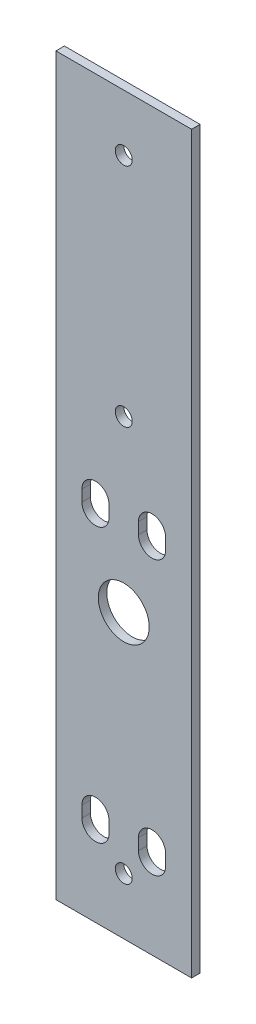
ISO-10303-21;
HEADER;
FILE_DESCRIPTION(('STEP AP214'),'2;1');
FILE_NAME('part.step','',(''),(''),'','','');
FILE_SCHEMA(('AUTOMOTIVE_DESIGN { 1 0 10303 214 1 1 1 1 }'));
ENDSEC;
DATA;
#1=APPLICATION_CONTEXT('core data for automotive mechanical design processes');
#2=APPLICATION_PROTOCOL_DEFINITION('international standard','automotive_design',2000,#1);
#3=PRODUCT_CONTEXT('',#1,'mechanical');
#4=PRODUCT('Part','Part','',(#3));
#5=PRODUCT_RELATED_PRODUCT_CATEGORY('part','',(#4));
#6=PRODUCT_DEFINITION_FORMATION('','',#4);
#7=PRODUCT_DEFINITION_CONTEXT('part definition',#1,'design');
#8=PRODUCT_DEFINITION('design','',#6,#7);
#9=PRODUCT_DEFINITION_SHAPE('','',#8);
#10=(LENGTH_UNIT() NAMED_UNIT(*) SI_UNIT(.MILLI.,.METRE.));
#11=(NAMED_UNIT(*) PLANE_ANGLE_UNIT() SI_UNIT($,.RADIAN.));
#12=(NAMED_UNIT(*) SI_UNIT($,.STERADIAN.) SOLID_ANGLE_UNIT());
#13=UNCERTAINTY_MEASURE_WITH_UNIT(LENGTH_MEASURE(1.E-05),#10,'distance_accuracy_value','');
#14=(GEOMETRIC_REPRESENTATION_CONTEXT(3) GLOBAL_UNCERTAINTY_ASSIGNED_CONTEXT((#13)) GLOBAL_UNIT_ASSIGNED_CONTEXT((#10,
#11,#12)) REPRESENTATION_CONTEXT('',''));
#15=CARTESIAN_POINT('',(0.,0.,0.));
#16=DIRECTION('',(0.,0.,1.));
#17=DIRECTION('',(1.,0.,0.));
#18=AXIS2_PLACEMENT_3D('',#15,#16,#17);
#19=CARTESIAN_POINT('',(0.,0.,1.5));
#20=DIRECTION('',(0.,0.,-1.));
#21=DIRECTION('',(-1.,0.,0.));
#22=AXIS2_PLACEMENT_3D('',#19,#20,#21);
#23=PLANE('',#22);
#24=CARTESIAN_POINT('',(-5.,-48.2,1.5));
#25=DIRECTION('',(0.,0.,1.));
#26=DIRECTION('',(-1.,0.,0.));
#27=AXIS2_PLACEMENT_3D('',#24,#25,#26);
#28=CIRCLE('',#27,2.4);
#29=CARTESIAN_POINT('',(-2.6,-48.2,1.5));
#30=VERTEX_POINT('',#29);
#31=CARTESIAN_POINT('',(-7.4,-48.2,1.5));
#32=VERTEX_POINT('',#31);
#33=EDGE_CURVE('E208',#30,#32,#28,.T.);
#34=ORIENTED_EDGE('',*,*,#33,.F.);
#35=DIRECTION('',(0.,1.,0.));
#36=VECTOR('',#35,1.);
#37=CARTESIAN_POINT('',(-2.6,-48.2,1.5));
#38=LINE('',#37,#36);
#39=CARTESIAN_POINT('',(-2.6,-50.2,1.5));
#40=VERTEX_POINT('',#39);
#41=EDGE_CURVE('E216',#40,#30,#38,.T.);
#42=ORIENTED_EDGE('',*,*,#41,.F.);
#43=CARTESIAN_POINT('',(-5.,-50.2,1.5));
#44=DIRECTION('',(0.,0.,1.));
#45=DIRECTION('',(-1.,0.,0.));
#46=AXIS2_PLACEMENT_3D('',#43,#44,#45);
#47=CIRCLE('',#46,2.4);
#48=CARTESIAN_POINT('',(-7.4,-50.2,1.5));
#49=VERTEX_POINT('',#48);
#50=EDGE_CURVE('E213',#49,#40,#47,.T.);
#51=ORIENTED_EDGE('',*,*,#50,.F.);
#52=DIRECTION('',(0.,-1.,0.));
#53=VECTOR('',#52,1.);
#54=CARTESIAN_POINT('',(-7.4,-48.2,1.5));
#55=LINE('',#54,#53);
#56=EDGE_CURVE('E210',#32,#49,#55,.T.);
#57=ORIENTED_EDGE('',*,*,#56,.F.);
#58=EDGE_LOOP('',(#34,#42,#51,#57));
#59=FACE_BOUND('',#58,.T.);
#60=CARTESIAN_POINT('',(-5.,-1.8,1.5));
#61=DIRECTION('',(0.,0.,1.));
#62=DIRECTION('',(1.,0.,0.));
#63=AXIS2_PLACEMENT_3D('',#60,#61,#62);
#64=CIRCLE('',#63,2.4);
#65=CARTESIAN_POINT('',(-7.4,-1.8,1.5));
#66=VERTEX_POINT('',#65);
#67=CARTESIAN_POINT('',(-2.6,-1.8,1.5));
#68=VERTEX_POINT('',#67);
#69=EDGE_CURVE('E270',#66,#68,#64,.T.);
#70=ORIENTED_EDGE('',*,*,#69,.F.);
#71=DIRECTION('',(0.,-1.,0.));
#72=VECTOR('',#71,1.);
#73=CARTESIAN_POINT('',(-7.4,-1.8,1.5));
#74=LINE('',#73,#72);
#75=CARTESIAN_POINT('',(-7.4,0.200000000000001,1.5));
#76=VERTEX_POINT('',#75);
#77=EDGE_CURVE('E278',#76,#66,#74,.T.);
#78=ORIENTED_EDGE('',*,*,#77,.F.);
#79=CARTESIAN_POINT('',(-5.,0.200000000000002,1.5));
#80=DIRECTION('',(0.,0.,1.));
#81=DIRECTION('',(1.,0.,0.));
#82=AXIS2_PLACEMENT_3D('',#79,#80,#81);
#83=CIRCLE('',#82,2.4);
#84=CARTESIAN_POINT('',(-2.6,0.200000000000003,1.5));
#85=VERTEX_POINT('',#84);
#86=EDGE_CURVE('E275',#85,#76,#83,.T.);
#87=ORIENTED_EDGE('',*,*,#86,.F.);
#88=DIRECTION('',(0.,1.,0.));
#89=VECTOR('',#88,1.);
#90=CARTESIAN_POINT('',(-2.6,-1.8,1.5));
#91=LINE('',#90,#89);
#92=EDGE_CURVE('E272',#68,#85,#91,.T.);
#93=ORIENTED_EDGE('',*,*,#92,.F.);
#94=EDGE_LOOP('',(#70,#78,#87,#93));
#95=FACE_BOUND('',#94,.T.);
#96=DIRECTION('',(0.,-1.,0.));
#97=VECTOR('',#96,1.);
#98=CARTESIAN_POINT('',(-12.,65.,1.5));
#99=LINE('',#98,#97);
#100=CARTESIAN_POINT('',(-12.,65.,1.5));
#101=VERTEX_POINT('',#100);
#102=CARTESIAN_POINT('',(-12.,-65.,1.5));
#103=VERTEX_POINT('',#102);
#104=EDGE_CURVE('E325',#101,#103,#99,.T.);
#105=ORIENTED_EDGE('',*,*,#104,.T.);
#106=DIRECTION('',(1.,0.,0.));
#107=VECTOR('',#106,1.);
#108=CARTESIAN_POINT('',(12.,-65.,1.5));
#109=LINE('',#108,#107);
#110=CARTESIAN_POINT('',(12.,-65.,1.5));
#111=VERTEX_POINT('',#110);
#112=EDGE_CURVE('E328',#103,#111,#109,.T.);
#113=ORIENTED_EDGE('',*,*,#112,.T.);
#114=DIRECTION('',(0.,1.,0.));
#115=VECTOR('',#114,1.);
#116=CARTESIAN_POINT('',(12.,65.,1.5));
#117=LINE('',#116,#115);
#118=CARTESIAN_POINT('',(12.,65.,1.5));
#119=VERTEX_POINT('',#118);
#120=EDGE_CURVE('E331',#111,#119,#117,.T.);
#121=ORIENTED_EDGE('',*,*,#120,.T.);
#122=DIRECTION('',(-1.,0.,0.));
#123=VECTOR('',#122,1.);
#124=CARTESIAN_POINT('',(12.,65.,1.5));
#125=LINE('',#124,#123);
#126=EDGE_CURVE('E333',#119,#101,#125,.T.);
#127=ORIENTED_EDGE('',*,*,#126,.T.);
#128=EDGE_LOOP('',(#105,#113,#121,#127));
#129=FACE_BOUND('',#128,.T.);
#130=CARTESIAN_POINT('',(0.,15.,1.5));
#131=DIRECTION('',(0.,0.,1.));
#132=DIRECTION('',(1.,0.,0.));
#133=AXIS2_PLACEMENT_3D('',#130,#131,#132);
#134=CIRCLE('',#133,1.5);
#135=CARTESIAN_POINT('',(1.5,15.,1.5));
#136=VERTEX_POINT('',#135);
#137=EDGE_CURVE('E319',#136,#136,#134,.T.);
#138=ORIENTED_EDGE('',*,*,#137,.F.);
#139=EDGE_LOOP('',(#138));
#140=FACE_BOUND('',#139,.T.);
#141=CARTESIAN_POINT('',(0.,-15.,1.5));
#142=DIRECTION('',(0.,0.,1.));
#143=DIRECTION('',(1.,0.,0.));
#144=AXIS2_PLACEMENT_3D('',#141,#142,#143);
#145=CIRCLE('',#144,4.5);
#146=CARTESIAN_POINT('',(4.5,-15.,1.5));
#147=VERTEX_POINT('',#146);
#148=EDGE_CURVE('E313',#147,#147,#145,.T.);
#149=ORIENTED_EDGE('',*,*,#148,.F.);
#150=EDGE_LOOP('',(#149));
#151=FACE_BOUND('',#150,.T.);
#152=CARTESIAN_POINT('',(0.,-55.,1.5));
#153=DIRECTION('',(0.,0.,1.));
#154=DIRECTION('',(1.,0.,0.));
#155=AXIS2_PLACEMENT_3D('',#152,#153,#154);
#156=CIRCLE('',#155,1.5);
#157=CARTESIAN_POINT('',(1.5,-55.,1.5));
#158=VERTEX_POINT('',#157);
#159=EDGE_CURVE('E307',#158,#158,#156,.T.);
#160=ORIENTED_EDGE('',*,*,#159,.F.);
#161=EDGE_LOOP('',(#160));
#162=FACE_BOUND('',#161,.T.);
#163=CARTESIAN_POINT('',(0.,55.,1.5));
#164=DIRECTION('',(0.,0.,1.));
#165=DIRECTION('',(-1.,0.,0.));
#166=AXIS2_PLACEMENT_3D('',#163,#164,#165);
#167=CIRCLE('',#166,1.5);
#168=CARTESIAN_POINT('',(-1.50000000000001,55.,1.5));
#169=VERTEX_POINT('',#168);
#170=EDGE_CURVE('E301',#169,#169,#167,.T.);
#171=ORIENTED_EDGE('',*,*,#170,.F.);
#172=EDGE_LOOP('',(#171));
#173=FACE_BOUND('',#172,.T.);
#174=CARTESIAN_POINT('',(4.99999999999998,-1.8,1.5));
#175=DIRECTION('',(0.,0.,1.));
#176=DIRECTION('',(-1.,0.,0.));
#177=AXIS2_PLACEMENT_3D('',#174,#175,#176);
#178=CIRCLE('',#177,2.4);
#179=CARTESIAN_POINT('',(2.59999999999998,-1.8,1.5));
#180=VERTEX_POINT('',#179);
#181=CARTESIAN_POINT('',(7.39999999999998,-1.8,1.5));
#182=VERTEX_POINT('',#181);
#183=EDGE_CURVE('E239',#180,#182,#178,.T.);
#184=ORIENTED_EDGE('',*,*,#183,.F.);
#185=DIRECTION('',(0.,-1.,0.));
#186=VECTOR('',#185,1.);
#187=CARTESIAN_POINT('',(2.59999999999998,-1.8,1.5));
#188=LINE('',#187,#186);
#189=CARTESIAN_POINT('',(2.59999999999998,0.200000000000003,1.5));
#190=VERTEX_POINT('',#189);
#191=EDGE_CURVE('E247',#190,#180,#188,.T.);
#192=ORIENTED_EDGE('',*,*,#191,.F.);
#193=CARTESIAN_POINT('',(4.99999999999998,0.200000000000002,1.5));
#194=DIRECTION('',(0.,0.,1.));
#195=DIRECTION('',(-1.,0.,0.));
#196=AXIS2_PLACEMENT_3D('',#193,#194,#195);
#197=CIRCLE('',#196,2.4);
#198=CARTESIAN_POINT('',(7.39999999999998,0.200000000000001,1.5));
#199=VERTEX_POINT('',#198);
#200=EDGE_CURVE('E244',#199,#190,#197,.T.);
#201=ORIENTED_EDGE('',*,*,#200,.F.);
#202=DIRECTION('',(0.,1.,0.));
#203=VECTOR('',#202,1.);
#204=CARTESIAN_POINT('',(7.39999999999998,-1.8,1.5));
#205=LINE('',#204,#203);
#206=EDGE_CURVE('E241',#182,#199,#205,.T.);
#207=ORIENTED_EDGE('',*,*,#206,.F.);
#208=EDGE_LOOP('',(#184,#192,#201,#207));
#209=FACE_BOUND('',#208,.T.);
#210=CARTESIAN_POINT('',(4.99999999999998,-48.2,1.5));
#211=DIRECTION('',(0.,0.,1.));
#212=DIRECTION('',(1.,0.,0.));
#213=AXIS2_PLACEMENT_3D('',#210,#211,#212);
#214=CIRCLE('',#213,2.4);
#215=CARTESIAN_POINT('',(7.39999999999998,-48.2,1.5));
#216=VERTEX_POINT('',#215);
#217=CARTESIAN_POINT('',(2.59999999999998,-48.2,1.5));
#218=VERTEX_POINT('',#217);
#219=EDGE_CURVE('E172',#216,#218,#214,.T.);
#220=ORIENTED_EDGE('',*,*,#219,.F.);
#221=DIRECTION('',(0.,1.,0.));
#222=VECTOR('',#221,1.);
#223=CARTESIAN_POINT('',(7.39999999999998,-48.2,1.5));
#224=LINE('',#223,#222);
#225=CARTESIAN_POINT('',(7.39999999999998,-50.2,1.5));
#226=VERTEX_POINT('',#225);
#227=EDGE_CURVE('E194',#226,#216,#224,.T.);
#228=ORIENTED_EDGE('',*,*,#227,.F.);
#229=CARTESIAN_POINT('',(4.99999999999998,-50.2,1.5));
#230=DIRECTION('',(0.,0.,1.));
#231=DIRECTION('',(1.,0.,0.));
#232=AXIS2_PLACEMENT_3D('',#229,#230,#231);
#233=CIRCLE('',#232,2.4);
#234=CARTESIAN_POINT('',(2.59999999999998,-50.2,1.5));
#235=VERTEX_POINT('',#234);
#236=EDGE_CURVE('E192',#235,#226,#233,.T.);
#237=ORIENTED_EDGE('',*,*,#236,.F.);
#238=DIRECTION('',(0.,-1.,0.));
#239=VECTOR('',#238,1.);
#240=CARTESIAN_POINT('',(2.59999999999998,-48.2,1.5));
#241=LINE('',#240,#239);
#242=EDGE_CURVE('E180',#218,#235,#241,.T.);
#243=ORIENTED_EDGE('',*,*,#242,.F.);
#244=EDGE_LOOP('',(#220,#228,#237,#243));
#245=FACE_BOUND('',#244,.T.);
#246=ADVANCED_FACE('F35',(#59,#95,#129,#140,#151,#162,#173,#209,#245),#23,.F.);
#247=CARTESIAN_POINT('',(0.,0.,0.));
#248=DIRECTION('',(0.,0.,-1.));
#249=DIRECTION('',(-1.,0.,0.));
#250=AXIS2_PLACEMENT_3D('',#247,#248,#249);
#251=PLANE('',#250);
#252=CARTESIAN_POINT('',(0.,-55.,0.));
#253=DIRECTION('',(0.,0.,1.));
#254=DIRECTION('',(1.,0.,0.));
#255=AXIS2_PLACEMENT_3D('',#252,#253,#254);
#256=CIRCLE('',#255,1.5);
#257=CARTESIAN_POINT('',(1.5,-55.,0.));
#258=VERTEX_POINT('',#257);
#259=EDGE_CURVE('E304',#258,#258,#256,.T.);
#260=ORIENTED_EDGE('',*,*,#259,.T.);
#261=EDGE_LOOP('',(#260));
#262=FACE_BOUND('',#261,.T.);
#263=CARTESIAN_POINT('',(0.,15.,0.));
#264=DIRECTION('',(0.,0.,1.));
#265=DIRECTION('',(1.,0.,0.));
#266=AXIS2_PLACEMENT_3D('',#263,#264,#265);
#267=CIRCLE('',#266,1.5);
#268=CARTESIAN_POINT('',(1.5,15.,0.));
#269=VERTEX_POINT('',#268);
#270=EDGE_CURVE('E316',#269,#269,#267,.T.);
#271=ORIENTED_EDGE('',*,*,#270,.T.);
#272=EDGE_LOOP('',(#271));
#273=FACE_BOUND('',#272,.T.);
#274=DIRECTION('',(0.,-1.,0.));
#275=VECTOR('',#274,1.);
#276=CARTESIAN_POINT('',(-12.,65.,0.));
#277=LINE('',#276,#275);
#278=CARTESIAN_POINT('',(-12.,65.,0.));
#279=VERTEX_POINT('',#278);
#280=CARTESIAN_POINT('',(-12.,-65.,0.));
#281=VERTEX_POINT('',#280);
#282=EDGE_CURVE('E322',#279,#281,#277,.T.);
#283=ORIENTED_EDGE('',*,*,#282,.F.);
#284=DIRECTION('',(-1.,0.,0.));
#285=VECTOR('',#284,1.);
#286=CARTESIAN_POINT('',(12.,65.,0.));
#287=LINE('',#286,#285);
#288=CARTESIAN_POINT('',(12.,65.,0.));
#289=VERTEX_POINT('',#288);
#290=EDGE_CURVE('E329',#289,#279,#287,.T.);
#291=ORIENTED_EDGE('',*,*,#290,.F.);
#292=DIRECTION('',(0.,1.,0.));
#293=VECTOR('',#292,1.);
#294=CARTESIAN_POINT('',(12.,65.,0.));
#295=LINE('',#294,#293);
#296=CARTESIAN_POINT('',(12.,-65.,0.));
#297=VERTEX_POINT('',#296);
#298=EDGE_CURVE('E340',#297,#289,#295,.T.);
#299=ORIENTED_EDGE('',*,*,#298,.F.);
#300=DIRECTION('',(1.,0.,0.));
#301=VECTOR('',#300,1.);
#302=CARTESIAN_POINT('',(12.,-65.,0.));
#303=LINE('',#302,#301);
#304=EDGE_CURVE('E338',#281,#297,#303,.T.);
#305=ORIENTED_EDGE('',*,*,#304,.F.);
#306=EDGE_LOOP('',(#283,#291,#299,#305));
#307=FACE_BOUND('',#306,.T.);
#308=CARTESIAN_POINT('',(0.,-15.,0.));
#309=DIRECTION('',(0.,0.,1.));
#310=DIRECTION('',(1.,0.,0.));
#311=AXIS2_PLACEMENT_3D('',#308,#309,#310);
#312=CIRCLE('',#311,4.5);
#313=CARTESIAN_POINT('',(4.5,-15.,0.));
#314=VERTEX_POINT('',#313);
#315=EDGE_CURVE('E310',#314,#314,#312,.T.);
#316=ORIENTED_EDGE('',*,*,#315,.T.);
#317=EDGE_LOOP('',(#316));
#318=FACE_BOUND('',#317,.T.);
#319=CARTESIAN_POINT('',(0.,55.,0.));
#320=DIRECTION('',(0.,0.,1.));
#321=DIRECTION('',(-1.,0.,0.));
#322=AXIS2_PLACEMENT_3D('',#319,#320,#321);
#323=CIRCLE('',#322,1.5);
#324=CARTESIAN_POINT('',(-1.50000000000001,55.,0.));
#325=VERTEX_POINT('',#324);
#326=EDGE_CURVE('E300',#325,#325,#323,.T.);
#327=ORIENTED_EDGE('',*,*,#326,.T.);
#328=EDGE_LOOP('',(#327));
#329=FACE_BOUND('',#328,.T.);
#330=DIRECTION('',(0.,-1.,0.));
#331=VECTOR('',#330,1.);
#332=CARTESIAN_POINT('',(-7.4,-1.8,0.));
#333=LINE('',#332,#331);
#334=CARTESIAN_POINT('',(-7.4,0.200000000000001,0.));
#335=VERTEX_POINT('',#334);
#336=CARTESIAN_POINT('',(-7.4,-1.8,0.));
#337=VERTEX_POINT('',#336);
#338=EDGE_CURVE('E273',#335,#337,#333,.T.);
#339=ORIENTED_EDGE('',*,*,#338,.T.);
#340=CARTESIAN_POINT('',(-5.,-1.8,0.));
#341=DIRECTION('',(0.,0.,1.));
#342=DIRECTION('',(1.,0.,0.));
#343=AXIS2_PLACEMENT_3D('',#340,#341,#342);
#344=CIRCLE('',#343,2.4);
#345=CARTESIAN_POINT('',(-2.6,-1.8,0.));
#346=VERTEX_POINT('',#345);
#347=EDGE_CURVE('E269',#337,#346,#344,.T.);
#348=ORIENTED_EDGE('',*,*,#347,.T.);
#349=DIRECTION('',(0.,1.,0.));
#350=VECTOR('',#349,1.);
#351=CARTESIAN_POINT('',(-2.6,-1.8,0.));
#352=LINE('',#351,#350);
#353=CARTESIAN_POINT('',(-2.6,0.200000000000003,0.));
#354=VERTEX_POINT('',#353);
#355=EDGE_CURVE('E283',#346,#354,#352,.T.);
#356=ORIENTED_EDGE('',*,*,#355,.T.);
#357=CARTESIAN_POINT('',(-5.,0.200000000000002,0.));
#358=DIRECTION('',(0.,0.,1.));
#359=DIRECTION('',(1.,0.,0.));
#360=AXIS2_PLACEMENT_3D('',#357,#358,#359);
#361=CIRCLE('',#360,2.4);
#362=EDGE_CURVE('E286',#354,#335,#361,.T.);
#363=ORIENTED_EDGE('',*,*,#362,.T.);
#364=EDGE_LOOP('',(#339,#348,#356,#363));
#365=FACE_BOUND('',#364,.T.);
#366=DIRECTION('',(0.,-1.,0.));
#367=VECTOR('',#366,1.);
#368=CARTESIAN_POINT('',(2.59999999999998,-1.8,0.));
#369=LINE('',#368,#367);
#370=CARTESIAN_POINT('',(2.59999999999998,0.200000000000003,0.));
#371=VERTEX_POINT('',#370);
#372=CARTESIAN_POINT('',(2.59999999999998,-1.8,0.));
#373=VERTEX_POINT('',#372);
#374=EDGE_CURVE('E242',#371,#373,#369,.T.);
#375=ORIENTED_EDGE('',*,*,#374,.T.);
#376=CARTESIAN_POINT('',(4.99999999999998,-1.8,0.));
#377=DIRECTION('',(0.,0.,1.));
#378=DIRECTION('',(-1.,0.,0.));
#379=AXIS2_PLACEMENT_3D('',#376,#377,#378);
#380=CIRCLE('',#379,2.4);
#381=CARTESIAN_POINT('',(7.39999999999998,-1.8,0.));
#382=VERTEX_POINT('',#381);
#383=EDGE_CURVE('E238',#373,#382,#380,.T.);
#384=ORIENTED_EDGE('',*,*,#383,.T.);
#385=DIRECTION('',(0.,1.,0.));
#386=VECTOR('',#385,1.);
#387=CARTESIAN_POINT('',(7.39999999999998,-1.8,0.));
#388=LINE('',#387,#386);
#389=CARTESIAN_POINT('',(7.39999999999998,0.200000000000001,0.));
#390=VERTEX_POINT('',#389);
#391=EDGE_CURVE('E252',#382,#390,#388,.T.);
#392=ORIENTED_EDGE('',*,*,#391,.T.);
#393=CARTESIAN_POINT('',(4.99999999999998,0.200000000000002,0.));
#394=DIRECTION('',(0.,0.,1.));
#395=DIRECTION('',(-1.,0.,0.));
#396=AXIS2_PLACEMENT_3D('',#393,#394,#395);
#397=CIRCLE('',#396,2.4);
#398=EDGE_CURVE('E255',#390,#371,#397,.T.);
#399=ORIENTED_EDGE('',*,*,#398,.T.);
#400=EDGE_LOOP('',(#375,#384,#392,#399));
#401=FACE_BOUND('',#400,.T.);
#402=DIRECTION('',(0.,1.,0.));
#403=VECTOR('',#402,1.);
#404=CARTESIAN_POINT('',(-2.6,-48.2,0.));
#405=LINE('',#404,#403);
#406=CARTESIAN_POINT('',(-2.6,-50.2,0.));
#407=VERTEX_POINT('',#406);
#408=CARTESIAN_POINT('',(-2.6,-48.2,0.));
#409=VERTEX_POINT('',#408);
#410=EDGE_CURVE('E211',#407,#409,#405,.T.);
#411=ORIENTED_EDGE('',*,*,#410,.T.);
#412=CARTESIAN_POINT('',(-5.,-48.2,0.));
#413=DIRECTION('',(0.,0.,1.));
#414=DIRECTION('',(-1.,0.,0.));
#415=AXIS2_PLACEMENT_3D('',#412,#413,#414);
#416=CIRCLE('',#415,2.4);
#417=CARTESIAN_POINT('',(-7.4,-48.2,0.));
#418=VERTEX_POINT('',#417);
#419=EDGE_CURVE('E188',#409,#418,#416,.T.);
#420=ORIENTED_EDGE('',*,*,#419,.T.);
#421=DIRECTION('',(0.,-1.,0.));
#422=VECTOR('',#421,1.);
#423=CARTESIAN_POINT('',(-7.4,-48.2,0.));
#424=LINE('',#423,#422);
#425=CARTESIAN_POINT('',(-7.4,-50.2,0.));
#426=VERTEX_POINT('',#425);
#427=EDGE_CURVE('E221',#418,#426,#424,.T.);
#428=ORIENTED_EDGE('',*,*,#427,.T.);
#429=CARTESIAN_POINT('',(-5.,-50.2,0.));
#430=DIRECTION('',(0.,0.,1.));
#431=DIRECTION('',(-1.,0.,0.));
#432=AXIS2_PLACEMENT_3D('',#429,#430,#431);
#433=CIRCLE('',#432,2.4);
#434=EDGE_CURVE('E224',#426,#407,#433,.T.);
#435=ORIENTED_EDGE('',*,*,#434,.T.);
#436=EDGE_LOOP('',(#411,#420,#428,#435));
#437=FACE_BOUND('',#436,.T.);
#438=DIRECTION('',(0.,1.,0.));
#439=VECTOR('',#438,1.);
#440=CARTESIAN_POINT('',(7.39999999999998,-48.2,0.));
#441=LINE('',#440,#439);
#442=CARTESIAN_POINT('',(7.39999999999998,-50.2,0.));
#443=VERTEX_POINT('',#442);
#444=CARTESIAN_POINT('',(7.39999999999998,-48.2,0.));
#445=VERTEX_POINT('',#444);
#446=EDGE_CURVE('E181',#443,#445,#441,.T.);
#447=ORIENTED_EDGE('',*,*,#446,.T.);
#448=CARTESIAN_POINT('',(4.99999999999998,-48.2,0.));
#449=DIRECTION('',(0.,0.,1.));
#450=DIRECTION('',(1.,0.,0.));
#451=AXIS2_PLACEMENT_3D('',#448,#449,#450);
#452=CIRCLE('',#451,2.4);
#453=CARTESIAN_POINT('',(2.59999999999998,-48.2,0.));
#454=VERTEX_POINT('',#453);
#455=EDGE_CURVE('E58',#445,#454,#452,.T.);
#456=ORIENTED_EDGE('',*,*,#455,.T.);
#457=DIRECTION('',(0.,-1.,0.));
#458=VECTOR('',#457,1.);
#459=CARTESIAN_POINT('',(2.59999999999998,-48.2,0.));
#460=LINE('',#459,#458);
#461=CARTESIAN_POINT('',(2.59999999999998,-50.2,0.));
#462=VERTEX_POINT('',#461);
#463=EDGE_CURVE('E187',#454,#462,#460,.T.);
#464=ORIENTED_EDGE('',*,*,#463,.T.);
#465=CARTESIAN_POINT('',(4.99999999999998,-50.2,0.));
#466=DIRECTION('',(0.,0.,1.));
#467=DIRECTION('',(1.,0.,0.));
#468=AXIS2_PLACEMENT_3D('',#465,#466,#467);
#469=CIRCLE('',#468,2.4);
#470=EDGE_CURVE('E200',#462,#443,#469,.T.);
#471=ORIENTED_EDGE('',*,*,#470,.T.);
#472=EDGE_LOOP('',(#447,#456,#464,#471));
#473=FACE_BOUND('',#472,.T.);
#474=ADVANCED_FACE('F358',(#262,#273,#307,#318,#329,#365,#401,#437,#473),#251,.T.);
#475=CARTESIAN_POINT('',(-12.,65.,1.5));
#476=DIRECTION('',(1.,0.,0.));
#477=DIRECTION('',(0.,0.,-1.));
#478=AXIS2_PLACEMENT_3D('',#475,#476,#477);
#479=PLANE('',#478);
#480=ORIENTED_EDGE('',*,*,#282,.T.);
#481=DIRECTION('',(0.,0.,-1.));
#482=VECTOR('',#481,1.);
#483=CARTESIAN_POINT('',(-12.,-65.,1.5));
#484=LINE('',#483,#482);
#485=EDGE_CURVE('E11',#103,#281,#484,.T.);
#486=ORIENTED_EDGE('',*,*,#485,.F.);
#487=ORIENTED_EDGE('',*,*,#104,.F.);
#488=DIRECTION('',(0.,0.,-1.));
#489=VECTOR('',#488,1.);
#490=CARTESIAN_POINT('',(-12.,65.,1.5));
#491=LINE('',#490,#489);
#492=EDGE_CURVE('E335',#101,#279,#491,.T.);
#493=ORIENTED_EDGE('',*,*,#492,.T.);
#494=EDGE_LOOP('',(#480,#486,#487,#493));
#495=FACE_BOUND('',#494,.T.);
#496=ADVANCED_FACE('F37',(#495),#479,.F.);
#497=CARTESIAN_POINT('',(12.,-65.,1.5));
#498=DIRECTION('',(0.,1.,0.));
#499=DIRECTION('',(0.,0.,1.));
#500=AXIS2_PLACEMENT_3D('',#497,#498,#499);
#501=PLANE('',#500);
#502=ORIENTED_EDGE('',*,*,#304,.T.);
#503=DIRECTION('',(0.,0.,-1.));
#504=VECTOR('',#503,1.);
#505=CARTESIAN_POINT('',(12.,-65.,1.5));
#506=LINE('',#505,#504);
#507=EDGE_CURVE('E43',#111,#297,#506,.T.);
#508=ORIENTED_EDGE('',*,*,#507,.F.);
#509=ORIENTED_EDGE('',*,*,#112,.F.);
#510=ORIENTED_EDGE('',*,*,#485,.T.);
#511=EDGE_LOOP('',(#502,#508,#509,#510));
#512=FACE_BOUND('',#511,.T.);
#513=ADVANCED_FACE('F369',(#512),#501,.F.);
#514=CARTESIAN_POINT('',(12.,65.,1.5));
#515=DIRECTION('',(-1.,0.,0.));
#516=DIRECTION('',(0.,0.,1.));
#517=AXIS2_PLACEMENT_3D('',#514,#515,#516);
#518=PLANE('',#517);
#519=ORIENTED_EDGE('',*,*,#298,.T.);
#520=DIRECTION('',(0.,0.,-1.));
#521=VECTOR('',#520,1.);
#522=CARTESIAN_POINT('',(12.,65.,1.5));
#523=LINE('',#522,#521);
#524=EDGE_CURVE('E345',#119,#289,#523,.T.);
#525=ORIENTED_EDGE('',*,*,#524,.F.);
#526=ORIENTED_EDGE('',*,*,#120,.F.);
#527=ORIENTED_EDGE('',*,*,#507,.T.);
#528=EDGE_LOOP('',(#519,#525,#526,#527));
#529=FACE_BOUND('',#528,.T.);
#530=ADVANCED_FACE('F352',(#529),#518,.F.);
#531=CARTESIAN_POINT('',(12.,65.,1.5));
#532=DIRECTION('',(0.,-1.,0.));
#533=DIRECTION('',(0.,0.,-1.));
#534=AXIS2_PLACEMENT_3D('',#531,#532,#533);
#535=PLANE('',#534);
#536=ORIENTED_EDGE('',*,*,#290,.T.);
#537=ORIENTED_EDGE('',*,*,#492,.F.);
#538=ORIENTED_EDGE('',*,*,#126,.F.);
#539=ORIENTED_EDGE('',*,*,#524,.T.);
#540=EDGE_LOOP('',(#536,#537,#538,#539));
#541=FACE_BOUND('',#540,.T.);
#542=ADVANCED_FACE('F362',(#541),#535,.F.);
#543=CARTESIAN_POINT('',(0.,15.,1.5));
#544=DIRECTION('',(0.,0.,-1.));
#545=DIRECTION('',(-1.,0.,0.));
#546=AXIS2_PLACEMENT_3D('',#543,#544,#545);
#547=CYLINDRICAL_SURFACE('',#546,1.5);
#548=ORIENTED_EDGE('',*,*,#137,.T.);
#549=EDGE_LOOP('',(#548));
#550=FACE_BOUND('',#549,.T.);
#551=ORIENTED_EDGE('',*,*,#270,.F.);
#552=EDGE_LOOP('',(#551));
#553=FACE_BOUND('',#552,.T.);
#554=ADVANCED_FACE('F387',(#550,#553),#547,.F.);
#555=CARTESIAN_POINT('',(0.,-15.,1.5));
#556=DIRECTION('',(0.,0.,-1.));
#557=DIRECTION('',(-1.,0.,0.));
#558=AXIS2_PLACEMENT_3D('',#555,#556,#557);
#559=CYLINDRICAL_SURFACE('',#558,4.5);
#560=ORIENTED_EDGE('',*,*,#148,.T.);
#561=EDGE_LOOP('',(#560));
#562=FACE_BOUND('',#561,.T.);
#563=ORIENTED_EDGE('',*,*,#315,.F.);
#564=EDGE_LOOP('',(#563));
#565=FACE_BOUND('',#564,.T.);
#566=ADVANCED_FACE('F394',(#562,#565),#559,.F.);
#567=CARTESIAN_POINT('',(0.,-55.,1.5));
#568=DIRECTION('',(0.,0.,-1.));
#569=DIRECTION('',(-1.,0.,0.));
#570=AXIS2_PLACEMENT_3D('',#567,#568,#569);
#571=CYLINDRICAL_SURFACE('',#570,1.5);
#572=ORIENTED_EDGE('',*,*,#159,.T.);
#573=EDGE_LOOP('',(#572));
#574=FACE_BOUND('',#573,.T.);
#575=ORIENTED_EDGE('',*,*,#259,.F.);
#576=EDGE_LOOP('',(#575));
#577=FACE_BOUND('',#576,.T.);
#578=ADVANCED_FACE('F399',(#574,#577),#571,.F.);
#579=CARTESIAN_POINT('',(0.,55.,1.5));
#580=DIRECTION('',(0.,0.,-1.));
#581=DIRECTION('',(-1.,0.,0.));
#582=AXIS2_PLACEMENT_3D('',#579,#580,#581);
#583=CYLINDRICAL_SURFACE('',#582,1.5);
#584=ORIENTED_EDGE('',*,*,#170,.T.);
#585=EDGE_LOOP('',(#584));
#586=FACE_BOUND('',#585,.T.);
#587=ORIENTED_EDGE('',*,*,#326,.F.);
#588=EDGE_LOOP('',(#587));
#589=FACE_BOUND('',#588,.T.);
#590=ADVANCED_FACE('F459',(#586,#589),#583,.F.);
#591=CARTESIAN_POINT('',(-5.,-1.8,1.5));
#592=DIRECTION('',(0.,0.,-1.));
#593=DIRECTION('',(-1.,0.,0.));
#594=AXIS2_PLACEMENT_3D('',#591,#592,#593);
#595=CYLINDRICAL_SURFACE('',#594,2.4);
#596=ORIENTED_EDGE('',*,*,#347,.F.);
#597=DIRECTION('',(0.,0.,-1.));
#598=VECTOR('',#597,1.);
#599=CARTESIAN_POINT('',(-7.4,-1.8,1.5));
#600=LINE('',#599,#598);
#601=EDGE_CURVE('E280',#66,#337,#600,.T.);
#602=ORIENTED_EDGE('',*,*,#601,.F.);
#603=ORIENTED_EDGE('',*,*,#69,.T.);
#604=DIRECTION('',(0.,0.,-1.));
#605=VECTOR('',#604,1.);
#606=CARTESIAN_POINT('',(-2.6,-1.8,1.5));
#607=LINE('',#606,#605);
#608=EDGE_CURVE('E297',#68,#346,#607,.T.);
#609=ORIENTED_EDGE('',*,*,#608,.T.);
#610=EDGE_LOOP('',(#596,#602,#603,#609));
#611=FACE_BOUND('',#610,.T.);
#612=ADVANCED_FACE('F455',(#611),#595,.F.);
#613=CARTESIAN_POINT('',(-2.6,-1.8,1.5));
#614=DIRECTION('',(-1.,0.,0.));
#615=DIRECTION('',(0.,-1.,0.));
#616=AXIS2_PLACEMENT_3D('',#613,#614,#615);
#617=PLANE('',#616);
#618=ORIENTED_EDGE('',*,*,#355,.F.);
#619=ORIENTED_EDGE('',*,*,#608,.F.);
#620=ORIENTED_EDGE('',*,*,#92,.T.);
#621=DIRECTION('',(0.,0.,-1.));
#622=VECTOR('',#621,1.);
#623=CARTESIAN_POINT('',(-2.6,0.200000000000003,1.5));
#624=LINE('',#623,#622);
#625=EDGE_CURVE('E295',#85,#354,#624,.T.);
#626=ORIENTED_EDGE('',*,*,#625,.T.);
#627=EDGE_LOOP('',(#618,#619,#620,#626));
#628=FACE_BOUND('',#627,.T.);
#629=ADVANCED_FACE('F451',(#628),#617,.T.);
#630=CARTESIAN_POINT('',(-5.,0.200000000000002,1.5));
#631=DIRECTION('',(0.,0.,-1.));
#632=DIRECTION('',(-1.,0.,0.));
#633=AXIS2_PLACEMENT_3D('',#630,#631,#632);
#634=CYLINDRICAL_SURFACE('',#633,2.4);
#635=ORIENTED_EDGE('',*,*,#362,.F.);
#636=ORIENTED_EDGE('',*,*,#625,.F.);
#637=ORIENTED_EDGE('',*,*,#86,.T.);
#638=DIRECTION('',(0.,0.,-1.));
#639=VECTOR('',#638,1.);
#640=CARTESIAN_POINT('',(-7.4,0.200000000000001,1.5));
#641=LINE('',#640,#639);
#642=EDGE_CURVE('E293',#76,#335,#641,.T.);
#643=ORIENTED_EDGE('',*,*,#642,.T.);
#644=EDGE_LOOP('',(#635,#636,#637,#643));
#645=FACE_BOUND('',#644,.T.);
#646=ADVANCED_FACE('F447',(#645),#634,.F.);
#647=CARTESIAN_POINT('',(-7.4,-1.8,1.5));
#648=DIRECTION('',(1.,0.,0.));
#649=DIRECTION('',(0.,0.,-1.));
#650=AXIS2_PLACEMENT_3D('',#647,#648,#649);
#651=PLANE('',#650);
#652=ORIENTED_EDGE('',*,*,#338,.F.);
#653=ORIENTED_EDGE('',*,*,#642,.F.);
#654=ORIENTED_EDGE('',*,*,#77,.T.);
#655=ORIENTED_EDGE('',*,*,#601,.T.);
#656=EDGE_LOOP('',(#652,#653,#654,#655));
#657=FACE_BOUND('',#656,.T.);
#658=ADVANCED_FACE('F444',(#657),#651,.T.);
#659=CARTESIAN_POINT('',(4.99999999999998,-1.8,1.5));
#660=DIRECTION('',(0.,0.,-1.));
#661=DIRECTION('',(-1.,0.,0.));
#662=AXIS2_PLACEMENT_3D('',#659,#660,#661);
#663=CYLINDRICAL_SURFACE('',#662,2.4);
#664=ORIENTED_EDGE('',*,*,#383,.F.);
#665=DIRECTION('',(0.,0.,-1.));
#666=VECTOR('',#665,1.);
#667=CARTESIAN_POINT('',(2.59999999999998,-1.8,1.5));
#668=LINE('',#667,#666);
#669=EDGE_CURVE('E249',#180,#373,#668,.T.);
#670=ORIENTED_EDGE('',*,*,#669,.F.);
#671=ORIENTED_EDGE('',*,*,#183,.T.);
#672=DIRECTION('',(0.,0.,-1.));
#673=VECTOR('',#672,1.);
#674=CARTESIAN_POINT('',(7.39999999999998,-1.8,1.5));
#675=LINE('',#674,#673);
#676=EDGE_CURVE('E266',#182,#382,#675,.T.);
#677=ORIENTED_EDGE('',*,*,#676,.T.);
#678=EDGE_LOOP('',(#664,#670,#671,#677));
#679=FACE_BOUND('',#678,.T.);
#680=ADVANCED_FACE('F419',(#679),#663,.F.);
#681=CARTESIAN_POINT('',(7.39999999999998,-1.8,1.5));
#682=DIRECTION('',(-1.,0.,0.));
#683=DIRECTION('',(0.,0.,1.));
#684=AXIS2_PLACEMENT_3D('',#681,#682,#683);
#685=PLANE('',#684);
#686=ORIENTED_EDGE('',*,*,#391,.F.);
#687=ORIENTED_EDGE('',*,*,#676,.F.);
#688=ORIENTED_EDGE('',*,*,#206,.T.);
#689=DIRECTION('',(0.,0.,-1.));
#690=VECTOR('',#689,1.);
#691=CARTESIAN_POINT('',(7.39999999999998,0.200000000000001,1.5));
#692=LINE('',#691,#690);
#693=EDGE_CURVE('E264',#199,#390,#692,.T.);
#694=ORIENTED_EDGE('',*,*,#693,.T.);
#695=EDGE_LOOP('',(#686,#687,#688,#694));
#696=FACE_BOUND('',#695,.T.);
#697=ADVANCED_FACE('F421',(#696),#685,.T.);
#698=CARTESIAN_POINT('',(4.99999999999998,0.200000000000002,1.5));
#699=DIRECTION('',(0.,0.,-1.));
#700=DIRECTION('',(-1.,0.,0.));
#701=AXIS2_PLACEMENT_3D('',#698,#699,#700);
#702=CYLINDRICAL_SURFACE('',#701,2.4);
#703=ORIENTED_EDGE('',*,*,#398,.F.);
#704=ORIENTED_EDGE('',*,*,#693,.F.);
#705=ORIENTED_EDGE('',*,*,#200,.T.);
#706=DIRECTION('',(0.,0.,-1.));
#707=VECTOR('',#706,1.);
#708=CARTESIAN_POINT('',(2.59999999999998,0.200000000000003,1.5));
#709=LINE('',#708,#707);
#710=EDGE_CURVE('E262',#190,#371,#709,.T.);
#711=ORIENTED_EDGE('',*,*,#710,.T.);
#712=EDGE_LOOP('',(#703,#704,#705,#711));
#713=FACE_BOUND('',#712,.T.);
#714=ADVANCED_FACE('F430',(#713),#702,.F.);
#715=CARTESIAN_POINT('',(2.59999999999998,-1.8,1.5));
#716=DIRECTION('',(1.,0.,0.));
#717=DIRECTION('',(0.,1.,0.));
#718=AXIS2_PLACEMENT_3D('',#715,#716,#717);
#719=PLANE('',#718);
#720=ORIENTED_EDGE('',*,*,#374,.F.);
#721=ORIENTED_EDGE('',*,*,#710,.F.);
#722=ORIENTED_EDGE('',*,*,#191,.T.);
#723=ORIENTED_EDGE('',*,*,#669,.T.);
#724=EDGE_LOOP('',(#720,#721,#722,#723));
#725=FACE_BOUND('',#724,.T.);
#726=ADVANCED_FACE('F428',(#725),#719,.T.);
#727=CARTESIAN_POINT('',(-5.,-48.2,1.5));
#728=DIRECTION('',(0.,0.,-1.));
#729=DIRECTION('',(-1.,0.,0.));
#730=AXIS2_PLACEMENT_3D('',#727,#728,#729);
#731=CYLINDRICAL_SURFACE('',#730,2.4);
#732=ORIENTED_EDGE('',*,*,#419,.F.);
#733=DIRECTION('',(0.,0.,-1.));
#734=VECTOR('',#733,1.);
#735=CARTESIAN_POINT('',(-2.6,-48.2,1.5));
#736=LINE('',#735,#734);
#737=EDGE_CURVE('E218',#30,#409,#736,.T.);
#738=ORIENTED_EDGE('',*,*,#737,.F.);
#739=ORIENTED_EDGE('',*,*,#33,.T.);
#740=DIRECTION('',(0.,0.,-1.));
#741=VECTOR('',#740,1.);
#742=CARTESIAN_POINT('',(-7.4,-48.2,1.5));
#743=LINE('',#742,#741);
#744=EDGE_CURVE('E235',#32,#418,#743,.T.);
#745=ORIENTED_EDGE('',*,*,#744,.T.);
#746=EDGE_LOOP('',(#732,#738,#739,#745));
#747=FACE_BOUND('',#746,.T.);
#748=ADVANCED_FACE('F437',(#747),#731,.F.);
#749=CARTESIAN_POINT('',(-7.4,-48.2,1.5));
#750=DIRECTION('',(1.,0.,0.));
#751=DIRECTION('',(0.,0.,-1.));
#752=AXIS2_PLACEMENT_3D('',#749,#750,#751);
#753=PLANE('',#752);
#754=ORIENTED_EDGE('',*,*,#427,.F.);
#755=ORIENTED_EDGE('',*,*,#744,.F.);
#756=ORIENTED_EDGE('',*,*,#56,.T.);
#757=DIRECTION('',(0.,0.,-1.));
#758=VECTOR('',#757,1.);
#759=CARTESIAN_POINT('',(-7.4,-50.2,1.5));
#760=LINE('',#759,#758);
#761=EDGE_CURVE('E233',#49,#426,#760,.T.);
#762=ORIENTED_EDGE('',*,*,#761,.T.);
#763=EDGE_LOOP('',(#754,#755,#756,#762));
#764=FACE_BOUND('',#763,.T.);
#765=ADVANCED_FACE('F519',(#764),#753,.T.);
#766=CARTESIAN_POINT('',(-5.,-50.2,1.5));
#767=DIRECTION('',(0.,0.,-1.));
#768=DIRECTION('',(-1.,0.,0.));
#769=AXIS2_PLACEMENT_3D('',#766,#767,#768);
#770=CYLINDRICAL_SURFACE('',#769,2.4);
#771=ORIENTED_EDGE('',*,*,#434,.F.);
#772=ORIENTED_EDGE('',*,*,#761,.F.);
#773=ORIENTED_EDGE('',*,*,#50,.T.);
#774=DIRECTION('',(0.,0.,-1.));
#775=VECTOR('',#774,1.);
#776=CARTESIAN_POINT('',(-2.6,-50.2,1.5));
#777=LINE('',#776,#775);
#778=EDGE_CURVE('E231',#40,#407,#777,.T.);
#779=ORIENTED_EDGE('',*,*,#778,.T.);
#780=EDGE_LOOP('',(#771,#772,#773,#779));
#781=FACE_BOUND('',#780,.T.);
#782=ADVANCED_FACE('F528',(#781),#770,.F.);
#783=CARTESIAN_POINT('',(-2.6,-48.2,1.5));
#784=DIRECTION('',(-1.,0.,0.));
#785=DIRECTION('',(0.,-1.,0.));
#786=AXIS2_PLACEMENT_3D('',#783,#784,#785);
#787=PLANE('',#786);
#788=ORIENTED_EDGE('',*,*,#410,.F.);
#789=ORIENTED_EDGE('',*,*,#778,.F.);
#790=ORIENTED_EDGE('',*,*,#41,.T.);
#791=ORIENTED_EDGE('',*,*,#737,.T.);
#792=EDGE_LOOP('',(#788,#789,#790,#791));
#793=FACE_BOUND('',#792,.T.);
#794=ADVANCED_FACE('F538',(#793),#787,.T.);
#795=CARTESIAN_POINT('',(4.99999999999998,-48.2,1.5));
#796=DIRECTION('',(0.,0.,-1.));
#797=DIRECTION('',(-1.,0.,0.));
#798=AXIS2_PLACEMENT_3D('',#795,#796,#797);
#799=CYLINDRICAL_SURFACE('',#798,2.4);
#800=ORIENTED_EDGE('',*,*,#455,.F.);
#801=DIRECTION('',(0.,0.,-1.));
#802=VECTOR('',#801,1.);
#803=CARTESIAN_POINT('',(7.39999999999998,-48.2,1.5));
#804=LINE('',#803,#802);
#805=EDGE_CURVE('E176',#216,#445,#804,.T.);
#806=ORIENTED_EDGE('',*,*,#805,.F.);
#807=ORIENTED_EDGE('',*,*,#219,.T.);
#808=DIRECTION('',(0.,0.,-1.));
#809=VECTOR('',#808,1.);
#810=CARTESIAN_POINT('',(2.59999999999998,-48.2,1.5));
#811=LINE('',#810,#809);
#812=EDGE_CURVE('E175',#218,#454,#811,.T.);
#813=ORIENTED_EDGE('',*,*,#812,.T.);
#814=EDGE_LOOP('',(#800,#806,#807,#813));
#815=FACE_BOUND('',#814,.T.);
#816=ADVANCED_FACE('F174',(#815),#799,.F.);
#817=CARTESIAN_POINT('',(2.59999999999998,-48.2,1.5));
#818=DIRECTION('',(1.,0.,0.));
#819=DIRECTION('',(0.,1.,0.));
#820=AXIS2_PLACEMENT_3D('',#817,#818,#819);
#821=PLANE('',#820);
#822=ORIENTED_EDGE('',*,*,#463,.F.);
#823=ORIENTED_EDGE('',*,*,#812,.F.);
#824=ORIENTED_EDGE('',*,*,#242,.T.);
#825=DIRECTION('',(0.,0.,-1.));
#826=VECTOR('',#825,1.);
#827=CARTESIAN_POINT('',(2.59999999999998,-50.2,1.5));
#828=LINE('',#827,#826);
#829=EDGE_CURVE('E189',#235,#462,#828,.T.);
#830=ORIENTED_EDGE('',*,*,#829,.T.);
#831=EDGE_LOOP('',(#822,#823,#824,#830));
#832=FACE_BOUND('',#831,.T.);
#833=ADVANCED_FACE('F184',(#832),#821,.T.);
#834=CARTESIAN_POINT('',(4.99999999999998,-50.2,1.5));
#835=DIRECTION('',(0.,0.,-1.));
#836=DIRECTION('',(-1.,0.,0.));
#837=AXIS2_PLACEMENT_3D('',#834,#835,#836);
#838=CYLINDRICAL_SURFACE('',#837,2.4);
#839=ORIENTED_EDGE('',*,*,#470,.F.);
#840=ORIENTED_EDGE('',*,*,#829,.F.);
#841=ORIENTED_EDGE('',*,*,#236,.T.);
#842=DIRECTION('',(0.,0.,-1.));
#843=VECTOR('',#842,1.);
#844=CARTESIAN_POINT('',(7.39999999999998,-50.2,1.5));
#845=LINE('',#844,#843);
#846=EDGE_CURVE('E50',#226,#443,#845,.T.);
#847=ORIENTED_EDGE('',*,*,#846,.T.);
#848=EDGE_LOOP('',(#839,#840,#841,#847));
#849=FACE_BOUND('',#848,.T.);
#850=ADVANCED_FACE('F565',(#849),#838,.F.);
#851=CARTESIAN_POINT('',(7.39999999999998,-48.2,1.5));
#852=DIRECTION('',(-1.,0.,0.));
#853=DIRECTION('',(0.,0.,1.));
#854=AXIS2_PLACEMENT_3D('',#851,#852,#853);
#855=PLANE('',#854);
#856=ORIENTED_EDGE('',*,*,#446,.F.);
#857=ORIENTED_EDGE('',*,*,#846,.F.);
#858=ORIENTED_EDGE('',*,*,#227,.T.);
#859=ORIENTED_EDGE('',*,*,#805,.T.);
#860=EDGE_LOOP('',(#856,#857,#858,#859));
#861=FACE_BOUND('',#860,.T.);
#862=ADVANCED_FACE('F574',(#861),#855,.T.);
#863=CLOSED_SHELL('',(#246,#474,#496,#513,#530,#542,#554,#566,#578,#590,#612,#629,#646,#658,
#680,#697,#714,#726,#748,#765,#782,#794,#816,#833,#850,#862));
#864=MANIFOLD_SOLID_BREP('B2',#863);
#865=ADVANCED_BREP_SHAPE_REPRESENTATION('',(#18,#864),#14);
#866=SHAPE_DEFINITION_REPRESENTATION(#9,#865);
ENDSEC;
END-ISO-10303-21;
